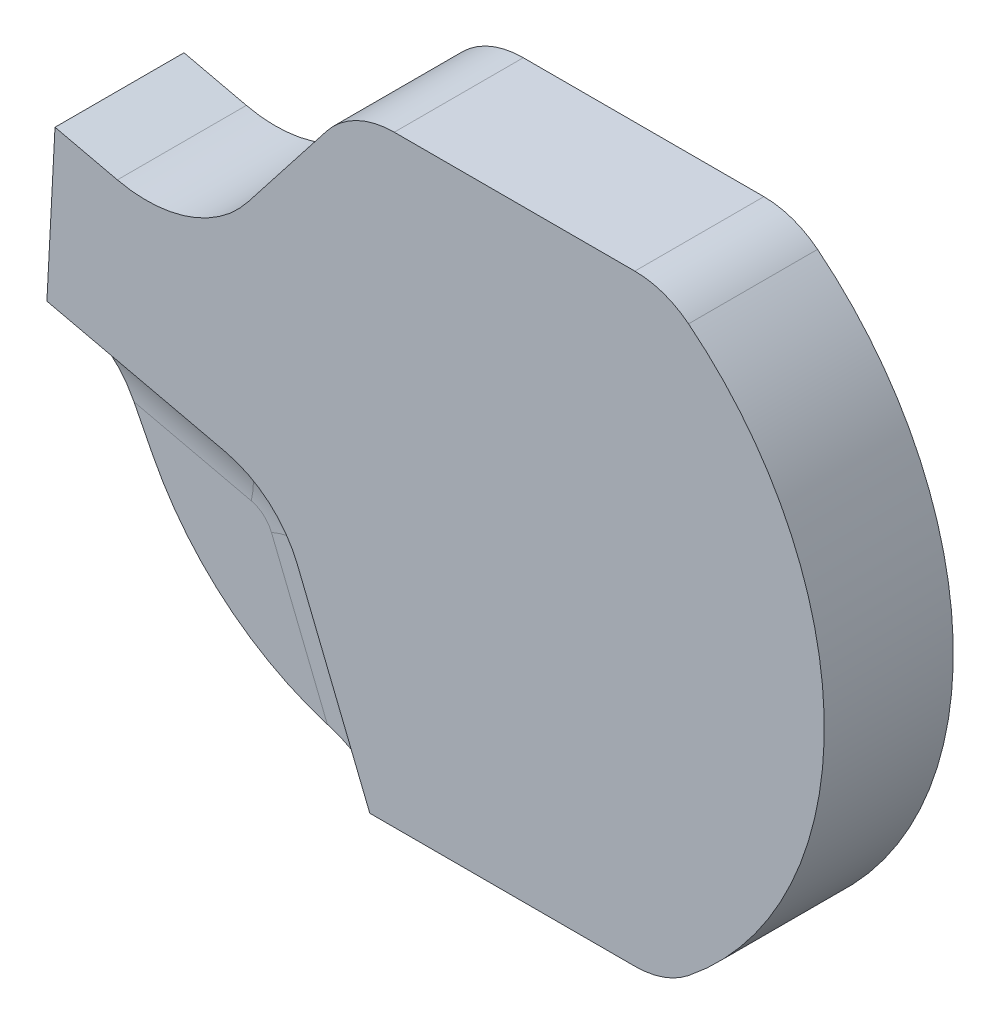
ISO-10303-21;
HEADER;
FILE_DESCRIPTION(('STEP AP214'),'2;1');
FILE_NAME('part.step','',(''),(''),'','','');
FILE_SCHEMA(('AUTOMOTIVE_DESIGN { 1 0 10303 214 1 1 1 1 }'));
ENDSEC;
DATA;
#1=APPLICATION_CONTEXT('core data for automotive mechanical design processes');
#2=APPLICATION_PROTOCOL_DEFINITION('international standard','automotive_design',2000,#1);
#3=PRODUCT_CONTEXT('',#1,'mechanical');
#4=PRODUCT('Part','Part','',(#3));
#5=PRODUCT_RELATED_PRODUCT_CATEGORY('part','',(#4));
#6=PRODUCT_DEFINITION_FORMATION('','',#4);
#7=PRODUCT_DEFINITION_CONTEXT('part definition',#1,'design');
#8=PRODUCT_DEFINITION('design','',#6,#7);
#9=PRODUCT_DEFINITION_SHAPE('','',#8);
#10=(LENGTH_UNIT() NAMED_UNIT(*) SI_UNIT(.MILLI.,.METRE.));
#11=(NAMED_UNIT(*) PLANE_ANGLE_UNIT() SI_UNIT($,.RADIAN.));
#12=(NAMED_UNIT(*) SI_UNIT($,.STERADIAN.) SOLID_ANGLE_UNIT());
#13=UNCERTAINTY_MEASURE_WITH_UNIT(LENGTH_MEASURE(1.E-05),#10,'distance_accuracy_value','');
#14=(GEOMETRIC_REPRESENTATION_CONTEXT(3) GLOBAL_UNCERTAINTY_ASSIGNED_CONTEXT((#13)) GLOBAL_UNIT_ASSIGNED_CONTEXT((#10,
#11,#12)) REPRESENTATION_CONTEXT('',''));
#15=CARTESIAN_POINT('',(0.,0.,0.));
#16=DIRECTION('',(0.,0.,1.));
#17=DIRECTION('',(1.,0.,0.));
#18=AXIS2_PLACEMENT_3D('',#15,#16,#17);
#19=CARTESIAN_POINT('',(-48.3882600591471,-2.20913909298127,15.));
#20=DIRECTION('',(0.891006524188372,0.453990499739538,0.));
#21=DIRECTION('',(-0.453990499739538,0.891006524188372,0.));
#22=AXIS2_PLACEMENT_3D('',#19,#20,#21);
#23=PLANE('',#22);
#24=DIRECTION('',(0.453990499739538,-0.891006524188372,0.));
#25=VECTOR('',#24,1.);
#26=CARTESIAN_POINT('',(-51.0702698081004,3.05460141618184,10.));
#27=LINE('',#26,#25);
#28=CARTESIAN_POINT('',(-43.2558253892938,-12.2821092948545,10.));
#29=VERTEX_POINT('',#28);
#30=CARTESIAN_POINT('',(-41.1394769418362,-16.4356769911443,10.));
#31=VERTEX_POINT('',#30);
#32=EDGE_CURVE('E320',#29,#31,#27,.T.);
#33=ORIENTED_EDGE('',*,*,#32,.F.);
#34=CARTESIAN_POINT('',(-43.2558253892938,-12.2821092948545,20.));
#35=DIRECTION('',(0.891006524188372,0.453990499739538,0.));
#36=DIRECTION('',(0.453990499739538,-0.891006524188372,0.));
#37=AXIS2_PLACEMENT_3D('',#34,#35,#36);
#38=ELLIPSE('',#37,13.0540728933227,10.);
#39=CARTESIAN_POINT('',(-48.3882600591471,-2.20913909298127,15.));
#40=VERTEX_POINT('',#39);
#41=EDGE_CURVE('E152',#29,#40,#38,.T.);
#42=ORIENTED_EDGE('',*,*,#41,.T.);
#43=DIRECTION('',(0.,0.,-1.));
#44=VECTOR('',#43,1.);
#45=CARTESIAN_POINT('',(-48.3882600591471,-2.20913909298127,15.));
#46=LINE('',#45,#44);
#47=CARTESIAN_POINT('',(-48.3882600591471,-2.20913909298127,0.));
#48=VERTEX_POINT('',#47);
#49=EDGE_CURVE('E62',#40,#48,#46,.T.);
#50=ORIENTED_EDGE('',*,*,#49,.T.);
#51=CARTESIAN_POINT('',(-43.2558253892938,-12.2821092948545,-5.));
#52=DIRECTION('',(0.891006524188372,0.453990499739538,0.));
#53=DIRECTION('',(0.453990499739538,-0.891006524188372,0.));
#54=AXIS2_PLACEMENT_3D('',#51,#52,#53);
#55=ELLIPSE('',#54,13.0540728933227,10.);
#56=CARTESIAN_POINT('',(-43.2558253892938,-12.2821092948545,5.));
#57=VERTEX_POINT('',#56);
#58=EDGE_CURVE('E45',#48,#57,#55,.T.);
#59=ORIENTED_EDGE('',*,*,#58,.T.);
#60=DIRECTION('',(-0.453990499739538,0.891006524188372,0.));
#61=VECTOR('',#60,1.);
#62=CARTESIAN_POINT('',(-48.3882600591471,-2.20913909298127,5.));
#63=LINE('',#62,#61);
#64=CARTESIAN_POINT('',(-41.1394769418362,-16.4356769911443,5.));
#65=VERTEX_POINT('',#64);
#66=EDGE_CURVE('E149',#65,#57,#63,.T.);
#67=ORIENTED_EDGE('',*,*,#66,.F.);
#68=DIRECTION('',(0.,0.,-1.));
#69=VECTOR('',#68,1.);
#70=CARTESIAN_POINT('',(-41.1394769418362,-16.4356769911443,15.));
#71=LINE('',#70,#69);
#72=EDGE_CURVE('E272',#31,#65,#71,.T.);
#73=ORIENTED_EDGE('',*,*,#72,.F.);
#74=EDGE_LOOP('',(#33,#42,#50,#59,#67,#73));
#75=FACE_BOUND('',#74,.T.);
#76=ADVANCED_FACE('F35',(#75),#23,.F.);
#77=CARTESIAN_POINT('',(-10.8452551194316,-0.999999999999999,15.));
#78=DIRECTION('',(0.,0.,-1.));
#79=DIRECTION('',(-1.,0.,0.));
#80=AXIS2_PLACEMENT_3D('',#77,#78,#79);
#81=CYLINDRICAL_SURFACE('',#80,34.);
#82=CARTESIAN_POINT('',(-10.8452551194316,-0.999999999999999,10.));
#83=DIRECTION('',(0.,0.,1.));
#84=DIRECTION('',(1.,0.,0.));
#85=AXIS2_PLACEMENT_3D('',#82,#83,#84);
#86=CIRCLE('',#85,34.);
#87=CARTESIAN_POINT('',(-20.7858745214471,-33.5143673766579,10.));
#88=VERTEX_POINT('',#87);
#89=EDGE_CURVE('E294',#31,#88,#86,.T.);
#90=ORIENTED_EDGE('',*,*,#89,.F.);
#91=ORIENTED_EDGE('',*,*,#72,.T.);
#92=CARTESIAN_POINT('',(-10.8452551194316,-0.999999999999999,5.));
#93=DIRECTION('',(0.,0.,-1.));
#94=DIRECTION('',(-1.,0.,0.));
#95=AXIS2_PLACEMENT_3D('',#92,#93,#94);
#96=CIRCLE('',#95,34.);
#97=CARTESIAN_POINT('',(-20.7858745214471,-33.5143673766578,5.));
#98=VERTEX_POINT('',#97);
#99=EDGE_CURVE('E376',#98,#65,#96,.T.);
#100=ORIENTED_EDGE('',*,*,#99,.F.);
#101=CARTESIAN_POINT('',(-20.7858745214471,-33.5143673766578,5.));
#102=CARTESIAN_POINT('',(-20.5824014908783,-33.5765773921944,4.99999636897066));
#103=CARTESIAN_POINT('',(-20.3783618980623,-33.6368667130892,4.9958977195484));
#104=CARTESIAN_POINT('',(-19.9694722426194,-33.7535321603187,4.97912104885075));
#105=CARTESIAN_POINT('',(-19.7646220115781,-33.8099074229066,4.96644114047289));
#106=CARTESIAN_POINT('',(-19.1486555100941,-33.973231663272,4.91487930008342));
#107=CARTESIAN_POINT('',(-18.7369391012313,-34.0741298952683,4.86247209172724));
#108=CARTESIAN_POINT('',(-17.9148027015898,-34.2595836593446,4.71842440237845));
#109=CARTESIAN_POINT('',(-17.5043954669564,-34.3440685969984,4.62661967066696));
#110=CARTESIAN_POINT('',(-16.6922909652377,-34.4960058923516,4.40126960981798));
#111=CARTESIAN_POINT('',(-16.2905842104175,-34.5634777562219,4.2677724796083));
#112=CARTESIAN_POINT('',(-15.6253349278063,-34.6634243203007,4.00594131674694));
#113=CARTESIAN_POINT('',(-15.357888520239,-34.7002438300998,3.88906061920885));
#114=CARTESIAN_POINT('',(-14.8320759103812,-34.7664833652139,3.63451834794716));
#115=CARTESIAN_POINT('',(-14.573709433976,-34.7959036140708,3.49685740222504));
#116=CARTESIAN_POINT('',(-14.0696293599529,-34.8477078822301,3.2015184461672));
#117=CARTESIAN_POINT('',(-13.8238604632259,-34.8701253419094,3.04394077792106));
#118=CARTESIAN_POINT('',(-13.3459599875046,-34.9087589776598,2.70862686852343));
#119=CARTESIAN_POINT('',(-13.113827191736,-34.9249757077471,2.5308924301581));
#120=CARTESIAN_POINT('',(-12.6909428155918,-34.9504506861143,2.1772941270268));
#121=CARTESIAN_POINT('',(-12.4984851583914,-34.9602899004989,2.00350858610352));
#122=CARTESIAN_POINT('',(-12.1276007103684,-34.9763158120366,1.64142881602736));
#123=CARTESIAN_POINT('',(-11.9491721884026,-34.9825029604562,1.45313638266626));
#124=CARTESIAN_POINT('',(-11.6064112243912,-34.9919150526872,1.06142497739436));
#125=CARTESIAN_POINT('',(-11.4422007129739,-34.9951163110218,0.857898662767727));
#126=CARTESIAN_POINT('',(-11.1306953253119,-34.9991584144982,0.438156174986671));
#127=CARTESIAN_POINT('',(-10.983406579984,-34.9999984067013,0.221935445128264));
#128=CARTESIAN_POINT('',(-10.8452551194316,-35.,0.));
#129=B_SPLINE_CURVE_WITH_KNOTS('',3,(#101,#102,#103,#104,#105,#106,#107,#108,#109,#110,#111,
#112,#113,#114,#115,#116,#117,#118,#119,#120,#121,#122,#123,#124,#125,#126,#127,#128),
.UNSPECIFIED.,.F.,.F.,(4,2,2,2,2,2,2,2,2,2,2,2,2,4),(0.,0.638214939910872,1.27657027513296,
2.55583017904862,3.84047601487553,5.12364218596572,6.00532786909668,6.88698691206913,
7.7643690334623,8.64167274513158,9.41937935639732,10.1969898504474,10.9807175247958,
11.7647282615994),.UNSPECIFIED.);
#130=CARTESIAN_POINT('',(-10.8452551194316,-35.,0.));
#131=VERTEX_POINT('',#130);
#132=EDGE_CURVE('E11',#98,#131,#129,.T.);
#133=ORIENTED_EDGE('',*,*,#132,.T.);
#134=DIRECTION('',(0.,0.,-1.));
#135=VECTOR('',#134,1.);
#136=CARTESIAN_POINT('',(-10.8452551194316,-35.,15.));
#137=LINE('',#136,#135);
#138=CARTESIAN_POINT('',(-10.8452551194316,-35.,15.));
#139=VERTEX_POINT('',#138);
#140=EDGE_CURVE('E53',#139,#131,#137,.T.);
#141=ORIENTED_EDGE('',*,*,#140,.F.);
#142=CARTESIAN_POINT('',(-10.8452551194316,-35.,15.));
#143=CARTESIAN_POINT('',(-10.9195231283957,-34.9999994893224,14.880729524576));
#144=CARTESIAN_POINT('',(-10.9964067097171,-34.9997566265536,14.7631103876154));
#145=CARTESIAN_POINT('',(-11.1552418628537,-34.998679763102,14.5313529205718));
#146=CARTESIAN_POINT('',(-11.2371932882871,-34.997845779486,14.4172144900925));
#147=CARTESIAN_POINT('',(-11.4903129903694,-34.9942988668677,14.0804080287862));
#148=CARTESIAN_POINT('',(-11.668833551996,-34.9905412229055,13.8632095396222));
#149=CARTESIAN_POINT('',(-12.0428760631038,-34.979413564975,13.4459164943761));
#150=CARTESIAN_POINT('',(-12.2383177252036,-34.9720599153071,13.2457492336729));
#151=CARTESIAN_POINT('',(-12.6451178395904,-34.9529371616458,12.8625123729255));
#152=CARTESIAN_POINT('',(-12.856477015057,-34.9411678569392,12.6794435505612));
#153=CARTESIAN_POINT('',(-13.2929533523944,-34.912483712812,12.3314446738349));
#154=CARTESIAN_POINT('',(-13.5180570808659,-34.8955738352419,12.1664973361138));
#155=CARTESIAN_POINT('',(-13.9802234098891,-34.8559560715417,11.8550798333857));
#156=CARTESIAN_POINT('',(-14.2172868535772,-34.833247776175,11.7086109736303));
#157=CARTESIAN_POINT('',(-14.7015027005375,-34.7814841848286,11.4343359389002));
#158=CARTESIAN_POINT('',(-14.9486617434447,-34.7524246553114,11.3065423075231));
#159=CARTESIAN_POINT('',(-15.4509377428568,-34.6875617361541,11.0697221300279));
#160=CARTESIAN_POINT('',(-15.706054822198,-34.6517582423745,10.9606958737632));
#161=CARTESIAN_POINT('',(-16.2384086343655,-34.5706837297125,10.7549520533553));
#162=CARTESIAN_POINT('',(-16.5160347038959,-34.5249626106216,10.659420544506));
#163=CARTESIAN_POINT('',(-17.0760448274719,-34.4254119094619,10.4886792674116));
#164=CARTESIAN_POINT('',(-17.3584293942435,-34.371581448589,10.4134717041302));
#165=CARTESIAN_POINT('',(-17.9260545755706,-34.2557693782644,10.2826209484564));
#166=CARTESIAN_POINT('',(-18.2112955131101,-34.1937868371781,10.2269799948458));
#167=CARTESIAN_POINT('',(-18.7828563468734,-34.0617680479135,10.1343833089674));
#168=CARTESIAN_POINT('',(-19.0691759766827,-33.9917336764914,10.0974232332724));
#169=CARTESIAN_POINT('',(-19.5947750728044,-33.8558527433217,10.0457721823688));
#170=CARTESIAN_POINT('',(-19.8341074740525,-33.791187284531,10.0284317083314));
#171=CARTESIAN_POINT('',(-20.3111887510113,-33.6566612193578,10.0055616634759));
#172=CARTESIAN_POINT('',(-20.5489401482296,-33.5868149390558,10.0000006937643));
#173=CARTESIAN_POINT('',(-20.7858745214471,-33.5143673766578,10.));
#174=B_SPLINE_CURVE_WITH_KNOTS('',3,(#142,#143,#144,#145,#146,#147,#148,#149,#150,#151,#152,
#153,#154,#155,#156,#157,#158,#159,#160,#161,#162,#163,#164,#165,#166,#167,#168,#169,#170,#171,
#172,#173),.UNSPECIFIED.,.F.,.F.,(4,2,2,2,2,2,2,2,2,2,2,2,2,2,2,4),(0.,0.42143797491096,
0.842863782508636,1.68522465594878,2.52378738723044,3.36238823989969,4.20018220370516,
5.03803531310138,5.87644862224617,6.71487487913582,7.60540747365494,8.49603664413292,
9.3867676859197,10.2772915314919,11.0225180797156,11.7657556743246),.UNSPECIFIED.);
#175=EDGE_CURVE('E150',#139,#88,#174,.T.);
#176=ORIENTED_EDGE('',*,*,#175,.T.);
#177=EDGE_LOOP('',(#90,#91,#100,#133,#141,#176));
#178=FACE_BOUND('',#177,.T.);
#179=ADVANCED_FACE('F163',(#178),#81,.T.);
#180=CARTESIAN_POINT('',(-8.00000000000001,25.,15.));
#181=DIRECTION('',(0.,0.,-1.));
#182=DIRECTION('',(-1.,0.,0.));
#183=AXIS2_PLACEMENT_3D('',#180,#181,#182);
#184=CYLINDRICAL_SURFACE('',#183,10.);
#185=CARTESIAN_POINT('',(-8.00000000000001,25.,0.));
#186=DIRECTION('',(0.,0.,1.));
#187=DIRECTION('',(1.,0.,0.));
#188=AXIS2_PLACEMENT_3D('',#185,#186,#187);
#189=CIRCLE('',#188,10.);
#190=CARTESIAN_POINT('',(-8.00000000000001,35.,0.));
#191=VERTEX_POINT('',#190);
#192=CARTESIAN_POINT('',(-15.8801075360673,31.1566147532565,0.));
#193=VERTEX_POINT('',#192);
#194=EDGE_CURVE('E232',#191,#193,#189,.T.);
#195=ORIENTED_EDGE('',*,*,#194,.T.);
#196=DIRECTION('',(0.,0.,-1.));
#197=VECTOR('',#196,1.);
#198=CARTESIAN_POINT('',(-15.8801075360673,31.1566147532565,15.));
#199=LINE('',#198,#197);
#200=CARTESIAN_POINT('',(-15.8801075360673,31.1566147532565,15.));
#201=VERTEX_POINT('',#200);
#202=EDGE_CURVE('E227',#201,#193,#199,.T.);
#203=ORIENTED_EDGE('',*,*,#202,.F.);
#204=CARTESIAN_POINT('',(-8.00000000000001,25.,15.));
#205=DIRECTION('',(0.,0.,1.));
#206=DIRECTION('',(1.,0.,0.));
#207=AXIS2_PLACEMENT_3D('',#204,#205,#206);
#208=CIRCLE('',#207,10.);
#209=CARTESIAN_POINT('',(-8.00000000000001,35.,15.));
#210=VERTEX_POINT('',#209);
#211=EDGE_CURVE('E258',#210,#201,#208,.T.);
#212=ORIENTED_EDGE('',*,*,#211,.F.);
#213=DIRECTION('',(0.,0.,-1.));
#214=VECTOR('',#213,1.);
#215=CARTESIAN_POINT('',(-8.00000000000001,35.,15.));
#216=LINE('',#215,#214);
#217=EDGE_CURVE('E259',#210,#191,#216,.T.);
#218=ORIENTED_EDGE('',*,*,#217,.T.);
#219=EDGE_LOOP('',(#195,#203,#212,#218));
#220=FACE_BOUND('',#219,.T.);
#221=ADVANCED_FACE('F174',(#220),#184,.T.);
#222=CARTESIAN_POINT('',(-15.8801075360673,31.1566147532565,15.));
#223=DIRECTION('',(0.788010753606725,-0.615661475325654,0.));
#224=DIRECTION('',(0.615661475325654,0.788010753606726,0.));
#225=AXIS2_PLACEMENT_3D('',#222,#223,#224);
#226=PLANE('',#225);
#227=DIRECTION('',(-0.615661475325654,-0.788010753606725,0.));
#228=VECTOR('',#227,1.);
#229=CARTESIAN_POINT('',(-15.8801075360673,31.1566147532565,0.));
#230=LINE('',#229,#228);
#231=CARTESIAN_POINT('',(-25.0001652410236,19.4834732086796,0.));
#232=VERTEX_POINT('',#231);
#233=EDGE_CURVE('E218',#193,#232,#230,.T.);
#234=ORIENTED_EDGE('',*,*,#233,.T.);
#235=DIRECTION('',(0.,0.,-1.));
#236=VECTOR('',#235,1.);
#237=CARTESIAN_POINT('',(-25.0001652410236,19.4834732086796,15.));
#238=LINE('',#237,#236);
#239=CARTESIAN_POINT('',(-25.0001652410236,19.4834732086796,15.));
#240=VERTEX_POINT('',#239);
#241=EDGE_CURVE('E223',#240,#232,#238,.T.);
#242=ORIENTED_EDGE('',*,*,#241,.F.);
#243=DIRECTION('',(-0.615661475325654,-0.788010753606725,0.));
#244=VECTOR('',#243,1.);
#245=CARTESIAN_POINT('',(-15.8801075360673,31.1566147532565,15.));
#246=LINE('',#245,#244);
#247=EDGE_CURVE('E366',#201,#240,#246,.T.);
#248=ORIENTED_EDGE('',*,*,#247,.F.);
#249=ORIENTED_EDGE('',*,*,#202,.T.);
#250=EDGE_LOOP('',(#234,#242,#248,#249));
#251=FACE_BOUND('',#250,.T.);
#252=ADVANCED_FACE('F206',(#251),#226,.F.);
#253=CARTESIAN_POINT('',(-36.8203265451244,28.7183953385644,15.));
#254=DIRECTION('',(0.,0.,-1.));
#255=DIRECTION('',(-1.,0.,0.));
#256=AXIS2_PLACEMENT_3D('',#253,#254,#255);
#257=CYLINDRICAL_SURFACE('',#256,15.);
#258=CARTESIAN_POINT('',(-36.8203265451244,28.7183953385644,0.));
#259=DIRECTION('',(0.,0.,1.));
#260=DIRECTION('',(1.,0.,0.));
#261=AXIS2_PLACEMENT_3D('',#258,#259,#260);
#262=CIRCLE('',#261,15.);
#263=CARTESIAN_POINT('',(-40.1945923602825,14.1028443667859,0.));
#264=VERTEX_POINT('',#263);
#265=EDGE_CURVE('E231',#264,#232,#262,.T.);
#266=ORIENTED_EDGE('',*,*,#265,.F.);
#267=DIRECTION('',(0.,0.,-1.));
#268=VECTOR('',#267,1.);
#269=CARTESIAN_POINT('',(-40.1945923602825,14.1028443667859,15.));
#270=LINE('',#269,#268);
#271=CARTESIAN_POINT('',(-40.1945923602825,14.1028443667859,15.));
#272=VERTEX_POINT('',#271);
#273=EDGE_CURVE('E278',#272,#264,#270,.T.);
#274=ORIENTED_EDGE('',*,*,#273,.F.);
#275=CARTESIAN_POINT('',(-36.8203265451244,28.7183953385644,15.));
#276=DIRECTION('',(0.,0.,1.));
#277=DIRECTION('',(1.,0.,0.));
#278=AXIS2_PLACEMENT_3D('',#275,#276,#277);
#279=CIRCLE('',#278,15.);
#280=EDGE_CURVE('E389',#272,#240,#279,.T.);
#281=ORIENTED_EDGE('',*,*,#280,.T.);
#282=ORIENTED_EDGE('',*,*,#241,.T.);
#283=EDGE_LOOP('',(#266,#274,#281,#282));
#284=FACE_BOUND('',#283,.T.);
#285=ADVANCED_FACE('F204',(#284),#257,.F.);
#286=CARTESIAN_POINT('',(-40.1945923602825,14.1028443667859,15.));
#287=DIRECTION('',(-0.224951054343868,-0.974370064785234,0.));
#288=DIRECTION('',(0.974370064785235,-0.224951054343868,0.));
#289=AXIS2_PLACEMENT_3D('',#286,#287,#288);
#290=PLANE('',#289);
#291=DIRECTION('',(-0.974370064785234,0.224951054343868,0.));
#292=VECTOR('',#291,1.);
#293=CARTESIAN_POINT('',(-40.1945923602825,14.1028443667859,0.));
#294=LINE('',#293,#292);
#295=CARTESIAN_POINT('',(-47.4456525559756,15.7768835179081,0.));
#296=VERTEX_POINT('',#295);
#297=EDGE_CURVE('E85',#264,#296,#294,.T.);
#298=ORIENTED_EDGE('',*,*,#297,.T.);
#299=DIRECTION('',(0.,0.,-1.));
#300=VECTOR('',#299,1.);
#301=CARTESIAN_POINT('',(-47.4456525559756,15.7768835179081,15.));
#302=LINE('',#301,#300);
#303=CARTESIAN_POINT('',(-47.4456525559756,15.7768835179081,15.));
#304=VERTEX_POINT('',#303);
#305=EDGE_CURVE('E276',#304,#296,#302,.T.);
#306=ORIENTED_EDGE('',*,*,#305,.F.);
#307=DIRECTION('',(-0.974370064785234,0.224951054343868,0.));
#308=VECTOR('',#307,1.);
#309=CARTESIAN_POINT('',(-40.1945923602825,14.1028443667859,15.));
#310=LINE('',#309,#308);
#311=EDGE_CURVE('E391',#272,#304,#310,.T.);
#312=ORIENTED_EDGE('',*,*,#311,.F.);
#313=ORIENTED_EDGE('',*,*,#273,.T.);
#314=EDGE_LOOP('',(#298,#306,#312,#313));
#315=FACE_BOUND('',#314,.T.);
#316=ADVANCED_FACE('F201',(#315),#290,.F.);
#317=CARTESIAN_POINT('',(-47.4456525559756,15.7768835179081,15.));
#318=DIRECTION('',(0.998629534754573,-0.0523359562429546,0.));
#319=DIRECTION('',(0.0523359562429546,0.998629534754573,0.));
#320=AXIS2_PLACEMENT_3D('',#317,#318,#319);
#321=PLANE('',#320);
#322=DIRECTION('',(-0.0523359562429546,-0.998629534754573,0.));
#323=VECTOR('',#322,1.);
#324=CARTESIAN_POINT('',(-47.4456525559756,15.7768835179081,0.));
#325=LINE('',#324,#323);
#326=EDGE_CURVE('E239',#296,#48,#325,.T.);
#327=ORIENTED_EDGE('',*,*,#326,.T.);
#328=ORIENTED_EDGE('',*,*,#49,.F.);
#329=DIRECTION('',(-0.0523359562429546,-0.998629534754573,0.));
#330=VECTOR('',#329,1.);
#331=CARTESIAN_POINT('',(-47.4456525559756,15.7768835179081,15.));
#332=LINE('',#331,#330);
#333=EDGE_CURVE('E325',#304,#40,#332,.T.);
#334=ORIENTED_EDGE('',*,*,#333,.F.);
#335=ORIENTED_EDGE('',*,*,#305,.T.);
#336=EDGE_LOOP('',(#327,#328,#334,#335));
#337=FACE_BOUND('',#336,.T.);
#338=ADVANCED_FACE('F197',(#337),#321,.F.);
#339=CARTESIAN_POINT('',(-8.,-35.,15.));
#340=DIRECTION('',(0.,1.,0.));
#341=DIRECTION('',(0.,0.,1.));
#342=AXIS2_PLACEMENT_3D('',#339,#340,#341);
#343=PLANE('',#342);
#344=DIRECTION('',(1.,0.,0.));
#345=VECTOR('',#344,1.);
#346=CARTESIAN_POINT('',(-8.,-35.,0.));
#347=LINE('',#346,#345);
#348=CARTESIAN_POINT('',(19.9749843554382,-35.,0.));
#349=VERTEX_POINT('',#348);
#350=EDGE_CURVE('E244',#131,#349,#347,.T.);
#351=ORIENTED_EDGE('',*,*,#350,.T.);
#352=DIRECTION('',(0.,0.,-1.));
#353=VECTOR('',#352,1.);
#354=CARTESIAN_POINT('',(19.9749843554382,-35.,15.));
#355=LINE('',#354,#353);
#356=CARTESIAN_POINT('',(19.9749843554382,-35.,15.));
#357=VERTEX_POINT('',#356);
#358=EDGE_CURVE('E268',#357,#349,#355,.T.);
#359=ORIENTED_EDGE('',*,*,#358,.F.);
#360=DIRECTION('',(-1.,0.,0.));
#361=VECTOR('',#360,1.);
#362=CARTESIAN_POINT('',(-8.,-35.,15.));
#363=LINE('',#362,#361);
#364=EDGE_CURVE('E394',#357,#139,#363,.T.);
#365=ORIENTED_EDGE('',*,*,#364,.T.);
#366=ORIENTED_EDGE('',*,*,#140,.T.);
#367=EDGE_LOOP('',(#351,#359,#365,#366));
#368=FACE_BOUND('',#367,.T.);
#369=ADVANCED_FACE('F200',(#368),#343,.F.);
#370=CARTESIAN_POINT('',(19.9749843554382,-25.,15.));
#371=DIRECTION('',(0.,0.,-1.));
#372=DIRECTION('',(-1.,0.,0.));
#373=AXIS2_PLACEMENT_3D('',#370,#371,#372);
#374=CYLINDRICAL_SURFACE('',#373,10.);
#375=CARTESIAN_POINT('',(19.9749843554382,-25.,0.));
#376=DIRECTION('',(0.,0.,1.));
#377=DIRECTION('',(1.,0.,0.));
#378=AXIS2_PLACEMENT_3D('',#375,#376,#377);
#379=CIRCLE('',#378,10.);
#380=CARTESIAN_POINT('',(26.2171669665126,-32.8125,0.));
#381=VERTEX_POINT('',#380);
#382=EDGE_CURVE('E246',#349,#381,#379,.T.);
#383=ORIENTED_EDGE('',*,*,#382,.T.);
#384=DIRECTION('',(0.,0.,-1.));
#385=VECTOR('',#384,1.);
#386=CARTESIAN_POINT('',(26.2171669665126,-32.8125,15.));
#387=LINE('',#386,#385);
#388=CARTESIAN_POINT('',(26.2171669665126,-32.8125,15.));
#389=VERTEX_POINT('',#388);
#390=EDGE_CURVE('E266',#389,#381,#387,.T.);
#391=ORIENTED_EDGE('',*,*,#390,.F.);
#392=CARTESIAN_POINT('',(19.9749843554382,-25.,15.));
#393=DIRECTION('',(0.,0.,1.));
#394=DIRECTION('',(1.,0.,0.));
#395=AXIS2_PLACEMENT_3D('',#392,#393,#394);
#396=CIRCLE('',#395,10.);
#397=EDGE_CURVE('E396',#357,#389,#396,.T.);
#398=ORIENTED_EDGE('',*,*,#397,.F.);
#399=ORIENTED_EDGE('',*,*,#358,.T.);
#400=EDGE_LOOP('',(#383,#391,#398,#399));
#401=FACE_BOUND('',#400,.T.);
#402=ADVANCED_FACE('F408',(#401),#374,.T.);
#403=CARTESIAN_POINT('',(0.,0.,15.));
#404=DIRECTION('',(0.,0.,-1.));
#405=DIRECTION('',(-1.,0.,0.));
#406=AXIS2_PLACEMENT_3D('',#403,#404,#405);
#407=CYLINDRICAL_SURFACE('',#406,42.);
#408=CARTESIAN_POINT('',(0.,0.,0.));
#409=DIRECTION('',(0.,0.,-1.));
#410=DIRECTION('',(-1.,0.,0.));
#411=AXIS2_PLACEMENT_3D('',#408,#409,#410);
#412=CIRCLE('',#411,42.);
#413=CARTESIAN_POINT('',(26.2171669665126,32.8125,0.));
#414=VERTEX_POINT('',#413);
#415=EDGE_CURVE('E249',#414,#381,#412,.T.);
#416=ORIENTED_EDGE('',*,*,#415,.F.);
#417=DIRECTION('',(0.,0.,-1.));
#418=VECTOR('',#417,1.);
#419=CARTESIAN_POINT('',(26.2171669665126,32.8125,15.));
#420=LINE('',#419,#418);
#421=CARTESIAN_POINT('',(26.2171669665126,32.8125,15.));
#422=VERTEX_POINT('',#421);
#423=EDGE_CURVE('E264',#422,#414,#420,.T.);
#424=ORIENTED_EDGE('',*,*,#423,.F.);
#425=CARTESIAN_POINT('',(0.,0.,15.));
#426=DIRECTION('',(0.,0.,-1.));
#427=DIRECTION('',(-1.,0.,0.));
#428=AXIS2_PLACEMENT_3D('',#425,#426,#427);
#429=CIRCLE('',#428,42.);
#430=EDGE_CURVE('E373',#422,#389,#429,.T.);
#431=ORIENTED_EDGE('',*,*,#430,.T.);
#432=ORIENTED_EDGE('',*,*,#390,.T.);
#433=EDGE_LOOP('',(#416,#424,#431,#432));
#434=FACE_BOUND('',#433,.T.);
#435=ADVANCED_FACE('F400',(#434),#407,.T.);
#436=CARTESIAN_POINT('',(19.9749843554382,25.,15.));
#437=DIRECTION('',(0.,0.,-1.));
#438=DIRECTION('',(-1.,0.,0.));
#439=AXIS2_PLACEMENT_3D('',#436,#437,#438);
#440=CYLINDRICAL_SURFACE('',#439,10.);
#441=CARTESIAN_POINT('',(19.9749843554382,25.,0.));
#442=DIRECTION('',(0.,0.,-1.));
#443=DIRECTION('',(-1.,0.,0.));
#444=AXIS2_PLACEMENT_3D('',#441,#442,#443);
#445=CIRCLE('',#444,10.);
#446=CARTESIAN_POINT('',(19.9749843554382,35.,0.));
#447=VERTEX_POINT('',#446);
#448=EDGE_CURVE('E252',#447,#414,#445,.T.);
#449=ORIENTED_EDGE('',*,*,#448,.F.);
#450=DIRECTION('',(0.,0.,-1.));
#451=VECTOR('',#450,1.);
#452=CARTESIAN_POINT('',(19.9749843554382,35.,15.));
#453=LINE('',#452,#451);
#454=CARTESIAN_POINT('',(19.9749843554382,35.,15.));
#455=VERTEX_POINT('',#454);
#456=EDGE_CURVE('E261',#455,#447,#453,.T.);
#457=ORIENTED_EDGE('',*,*,#456,.F.);
#458=CARTESIAN_POINT('',(19.9749843554382,25.,15.));
#459=DIRECTION('',(0.,0.,-1.));
#460=DIRECTION('',(-1.,0.,0.));
#461=AXIS2_PLACEMENT_3D('',#458,#459,#460);
#462=CIRCLE('',#461,10.);
#463=EDGE_CURVE('E371',#455,#422,#462,.T.);
#464=ORIENTED_EDGE('',*,*,#463,.T.);
#465=ORIENTED_EDGE('',*,*,#423,.T.);
#466=EDGE_LOOP('',(#449,#457,#464,#465));
#467=FACE_BOUND('',#466,.T.);
#468=ADVANCED_FACE('F405',(#467),#440,.T.);
#469=CARTESIAN_POINT('',(-8.00000000000001,35.,15.));
#470=DIRECTION('',(0.,1.,0.));
#471=DIRECTION('',(0.,0.,1.));
#472=AXIS2_PLACEMENT_3D('',#469,#470,#471);
#473=PLANE('',#472);
#474=DIRECTION('',(1.,0.,0.));
#475=VECTOR('',#474,1.);
#476=CARTESIAN_POINT('',(-8.00000000000001,35.,0.));
#477=LINE('',#476,#475);
#478=EDGE_CURVE('E255',#191,#447,#477,.T.);
#479=ORIENTED_EDGE('',*,*,#478,.F.);
#480=ORIENTED_EDGE('',*,*,#217,.F.);
#481=DIRECTION('',(1.,0.,0.));
#482=VECTOR('',#481,1.);
#483=CARTESIAN_POINT('',(-8.00000000000001,35.,15.));
#484=LINE('',#483,#482);
#485=EDGE_CURVE('E262',#210,#455,#484,.T.);
#486=ORIENTED_EDGE('',*,*,#485,.T.);
#487=ORIENTED_EDGE('',*,*,#456,.T.);
#488=EDGE_LOOP('',(#479,#480,#486,#487));
#489=FACE_BOUND('',#488,.T.);
#490=ADVANCED_FACE('F363',(#489),#473,.T.);
#491=CARTESIAN_POINT('',(-8.00000000000001,25.,15.));
#492=DIRECTION('',(0.,0.,1.));
#493=DIRECTION('',(1.,0.,0.));
#494=AXIS2_PLACEMENT_3D('',#491,#492,#493);
#495=PLANE('',#494);
#496=DIRECTION('',(-0.974370064785235,0.224951054343868,0.));
#497=VECTOR('',#496,1.);
#498=CARTESIAN_POINT('',(-16.0076169424686,-9.68479959681136,15.));
#499=LINE('',#498,#497);
#500=CARTESIAN_POINT('',(-27.6810743326112,-6.98976960496777,15.));
#501=VERTEX_POINT('',#500);
#502=EDGE_CURVE('E311',#501,#40,#499,.T.);
#503=ORIENTED_EDGE('',*,*,#502,.F.);
#504=CARTESIAN_POINT('',(-30.3804869847376,-18.6822103823906,15.));
#505=DIRECTION('',(0.,0.,1.));
#506=DIRECTION('',(1.,0.,0.));
#507=AXIS2_PLACEMENT_3D('',#504,#505,#506);
#508=CIRCLE('',#507,12.);
#509=CARTESIAN_POINT('',(-19.2542807299362,-14.1869312613995,15.));
#510=VERTEX_POINT('',#509);
#511=EDGE_CURVE('E309',#510,#501,#508,.T.);
#512=ORIENTED_EDGE('',*,*,#511,.F.);
#513=DIRECTION('',(-0.37460659341592,0.927183854566784,0.));
#514=VECTOR('',#513,1.);
#515=CARTESIAN_POINT('',(-31.2857312982483,15.591953867757,15.));
#516=LINE('',#515,#514);
#517=EDGE_CURVE('E301',#139,#510,#516,.T.);
#518=ORIENTED_EDGE('',*,*,#517,.F.);
#519=ORIENTED_EDGE('',*,*,#364,.F.);
#520=ORIENTED_EDGE('',*,*,#397,.T.);
#521=ORIENTED_EDGE('',*,*,#430,.F.);
#522=ORIENTED_EDGE('',*,*,#463,.F.);
#523=ORIENTED_EDGE('',*,*,#485,.F.);
#524=ORIENTED_EDGE('',*,*,#211,.T.);
#525=ORIENTED_EDGE('',*,*,#247,.T.);
#526=ORIENTED_EDGE('',*,*,#280,.F.);
#527=ORIENTED_EDGE('',*,*,#311,.T.);
#528=ORIENTED_EDGE('',*,*,#333,.T.);
#529=EDGE_LOOP('',(#503,#512,#518,#519,#520,#521,#522,#523,#524,#525,#526,#527,#528));
#530=FACE_BOUND('',#529,.T.);
#531=ADVANCED_FACE('F323',(#530),#495,.T.);
#532=CARTESIAN_POINT('',(-8.00000000000001,25.,0.));
#533=DIRECTION('',(0.,0.,1.));
#534=DIRECTION('',(1.,0.,0.));
#535=AXIS2_PLACEMENT_3D('',#532,#533,#534);
#536=PLANE('',#535);
#537=ORIENTED_EDGE('',*,*,#350,.F.);
#538=DIRECTION('',(0.37460659341592,-0.927183854566784,0.));
#539=VECTOR('',#538,1.);
#540=CARTESIAN_POINT('',(-19.2542807299362,-14.1869312613996,0.));
#541=LINE('',#540,#539);
#542=CARTESIAN_POINT('',(-19.2542807299362,-14.1869312613996,0.));
#543=VERTEX_POINT('',#542);
#544=EDGE_CURVE('E379',#543,#131,#541,.T.);
#545=ORIENTED_EDGE('',*,*,#544,.F.);
#546=CARTESIAN_POINT('',(-30.3804869847376,-18.6822103823906,0.));
#547=DIRECTION('',(0.,0.,-1.));
#548=DIRECTION('',(-1.,0.,0.));
#549=AXIS2_PLACEMENT_3D('',#546,#547,#548);
#550=CIRCLE('',#549,12.);
#551=CARTESIAN_POINT('',(-27.6810743326112,-6.98976960496777,0.));
#552=VERTEX_POINT('',#551);
#553=EDGE_CURVE('E384',#552,#543,#550,.T.);
#554=ORIENTED_EDGE('',*,*,#553,.F.);
#555=DIRECTION('',(0.974370064785235,-0.224951054343868,0.));
#556=VECTOR('',#555,1.);
#557=CARTESIAN_POINT('',(-48.3882600591471,-2.20913909298127,0.));
#558=LINE('',#557,#556);
#559=EDGE_CURVE('E133',#48,#552,#558,.T.);
#560=ORIENTED_EDGE('',*,*,#559,.F.);
#561=ORIENTED_EDGE('',*,*,#326,.F.);
#562=ORIENTED_EDGE('',*,*,#297,.F.);
#563=ORIENTED_EDGE('',*,*,#265,.T.);
#564=ORIENTED_EDGE('',*,*,#233,.F.);
#565=ORIENTED_EDGE('',*,*,#194,.F.);
#566=ORIENTED_EDGE('',*,*,#478,.T.);
#567=ORIENTED_EDGE('',*,*,#448,.T.);
#568=ORIENTED_EDGE('',*,*,#415,.T.);
#569=ORIENTED_EDGE('',*,*,#382,.F.);
#570=EDGE_LOOP('',(#537,#545,#554,#560,#561,#562,#563,#564,#565,#566,#567,#568,#569));
#571=FACE_BOUND('',#570,.T.);
#572=ADVANCED_FACE('F235',(#571),#536,.F.);
#573=CARTESIAN_POINT('',(-10.8452551194316,-0.999999999999999,5.));
#574=DIRECTION('',(0.,0.,-1.));
#575=DIRECTION('',(-1.,0.,0.));
#576=AXIS2_PLACEMENT_3D('',#573,#574,#575);
#577=PLANE('',#576);
#578=ORIENTED_EDGE('',*,*,#66,.T.);
#579=DIRECTION('',(-0.974370064785235,0.224951054343868,0.));
#580=VECTOR('',#579,1.);
#581=CARTESIAN_POINT('',(-29.62920760931,-15.4280618928788,5.));
#582=LINE('',#581,#580);
#583=CARTESIAN_POINT('',(-29.62920760931,-15.4280618928788,5.));
#584=VERTEX_POINT('',#583);
#585=EDGE_CURVE('E131',#57,#584,#582,.F.);
#586=ORIENTED_EDGE('',*,*,#585,.T.);
#587=CARTESIAN_POINT('',(-30.3804869847376,-18.6822103823906,5.));
#588=DIRECTION('',(0.,0.,-1.));
#589=DIRECTION('',(-1.,0.,0.));
#590=AXIS2_PLACEMENT_3D('',#587,#588,#589);
#591=CIRCLE('',#590,3.33974596215562);
#592=CARTESIAN_POINT('',(-27.2839284502723,-17.4311195246329,5.));
#593=VERTEX_POINT('',#592);
#594=EDGE_CURVE('E137',#584,#593,#591,.T.);
#595=ORIENTED_EDGE('',*,*,#594,.T.);
#596=DIRECTION('',(-0.37460659341592,0.927183854566784,0.));
#597=VECTOR('',#596,1.);
#598=CARTESIAN_POINT('',(-18.8749028397677,-38.2441882632333,5.));
#599=LINE('',#598,#597);
#600=EDGE_CURVE('E142',#593,#98,#599,.F.);
#601=ORIENTED_EDGE('',*,*,#600,.T.);
#602=ORIENTED_EDGE('',*,*,#99,.T.);
#603=EDGE_LOOP('',(#578,#586,#595,#601,#602));
#604=FACE_BOUND('',#603,.T.);
#605=ADVANCED_FACE('F146',(#604),#577,.T.);
#606=CARTESIAN_POINT('',(-10.8452551194316,-0.999999999999999,10.));
#607=DIRECTION('',(0.,0.,1.));
#608=DIRECTION('',(1.,0.,0.));
#609=AXIS2_PLACEMENT_3D('',#606,#607,#608);
#610=PLANE('',#609);
#611=ORIENTED_EDGE('',*,*,#89,.T.);
#612=DIRECTION('',(-0.37460659341592,0.927183854566784,0.));
#613=VECTOR('',#612,1.);
#614=CARTESIAN_POINT('',(-27.2839284502723,-17.4311195246329,10.));
#615=LINE('',#614,#613);
#616=CARTESIAN_POINT('',(-27.2839284502723,-17.4311195246329,10.));
#617=VERTEX_POINT('',#616);
#618=EDGE_CURVE('E143',#88,#617,#615,.T.);
#619=ORIENTED_EDGE('',*,*,#618,.T.);
#620=CARTESIAN_POINT('',(-30.3804869847376,-18.6822103823906,10.));
#621=DIRECTION('',(0.,0.,1.));
#622=DIRECTION('',(1.,0.,0.));
#623=AXIS2_PLACEMENT_3D('',#620,#621,#622);
#624=CIRCLE('',#623,3.33974596215561);
#625=CARTESIAN_POINT('',(-29.62920760931,-15.4280618928788,10.));
#626=VERTEX_POINT('',#625);
#627=EDGE_CURVE('E282',#617,#626,#624,.T.);
#628=ORIENTED_EDGE('',*,*,#627,.T.);
#629=DIRECTION('',(-0.974370064785235,0.224951054343868,0.));
#630=VECTOR('',#629,1.);
#631=CARTESIAN_POINT('',(-50.336393335846,-10.6474313808923,10.));
#632=LINE('',#631,#630);
#633=EDGE_CURVE('E284',#626,#29,#632,.T.);
#634=ORIENTED_EDGE('',*,*,#633,.T.);
#635=ORIENTED_EDGE('',*,*,#32,.T.);
#636=EDGE_LOOP('',(#611,#619,#628,#634,#635));
#637=FACE_BOUND('',#636,.T.);
#638=ADVANCED_FACE('F182',(#637),#610,.T.);
#639=CARTESIAN_POINT('',(-17.9557502191675,-18.1230918847224,20.));
#640=DIRECTION('',(0.974370064785235,-0.224951054343868,0.));
#641=DIRECTION('',(0.224951054343868,0.974370064785235,0.));
#642=AXIS2_PLACEMENT_3D('',#639,#640,#641);
#643=CYLINDRICAL_SURFACE('',#642,10.);
#644=ORIENTED_EDGE('',*,*,#41,.F.);
#645=ORIENTED_EDGE('',*,*,#633,.F.);
#646=CARTESIAN_POINT('',(-29.62920760931,-15.4280618928788,20.));
#647=DIRECTION('',(-0.974370064785234,0.224951054343868,0.));
#648=DIRECTION('',(-0.224951054343868,-0.974370064785234,0.));
#649=AXIS2_PLACEMENT_3D('',#646,#647,#648);
#650=CIRCLE('',#649,10.);
#651=EDGE_CURVE('E303',#501,#626,#650,.T.);
#652=ORIENTED_EDGE('',*,*,#651,.F.);
#653=ORIENTED_EDGE('',*,*,#502,.T.);
#654=EDGE_LOOP('',(#644,#645,#652,#653));
#655=FACE_BOUND('',#654,.T.);
#656=ADVANCED_FACE('F178',(#655),#643,.F.);
#657=CARTESIAN_POINT('',(-30.3804869847376,-18.6822103823906,20.));
#658=DIRECTION('',(0.,0.,-1.));
#659=DIRECTION('',(-1.,0.,0.));
#660=AXIS2_PLACEMENT_3D('',#657,#658,#659);
#661=DEGENERATE_TOROIDAL_SURFACE('',#660,3.33974596215561,10.,.T.);
#662=ORIENTED_EDGE('',*,*,#651,.T.);
#663=ORIENTED_EDGE('',*,*,#627,.F.);
#664=CARTESIAN_POINT('',(-27.2839284502723,-17.4311195246329,20.));
#665=DIRECTION('',(-0.37460659341592,0.927183854566784,0.));
#666=DIRECTION('',(-0.927183854566784,-0.37460659341592,0.));
#667=AXIS2_PLACEMENT_3D('',#664,#665,#666);
#668=CIRCLE('',#667,10.);
#669=EDGE_CURVE('E298',#510,#617,#668,.T.);
#670=ORIENTED_EDGE('',*,*,#669,.F.);
#671=ORIENTED_EDGE('',*,*,#511,.T.);
#672=EDGE_LOOP('',(#662,#663,#670,#671));
#673=FACE_BOUND('',#672,.T.);
#674=ADVANCED_FACE('F172',(#673),#661,.F.);
#675=CARTESIAN_POINT('',(-39.3153790185844,12.3477656045236,20.));
#676=DIRECTION('',(0.37460659341592,-0.927183854566784,0.));
#677=DIRECTION('',(0.927183854566784,0.37460659341592,0.));
#678=AXIS2_PLACEMENT_3D('',#675,#676,#677);
#679=CYLINDRICAL_SURFACE('',#678,10.);
#680=ORIENTED_EDGE('',*,*,#175,.F.);
#681=ORIENTED_EDGE('',*,*,#517,.T.);
#682=ORIENTED_EDGE('',*,*,#669,.T.);
#683=ORIENTED_EDGE('',*,*,#618,.F.);
#684=EDGE_LOOP('',(#680,#681,#682,#683));
#685=FACE_BOUND('',#684,.T.);
#686=ADVANCED_FACE('F167',(#685),#679,.F.);
#687=CARTESIAN_POINT('',(-27.2839284502723,-17.4311195246329,-5.));
#688=DIRECTION('',(0.37460659341592,-0.927183854566784,0.));
#689=DIRECTION('',(0.927183854566784,0.37460659341592,0.));
#690=AXIS2_PLACEMENT_3D('',#687,#688,#689);
#691=CYLINDRICAL_SURFACE('',#690,10.);
#692=ORIENTED_EDGE('',*,*,#132,.F.);
#693=ORIENTED_EDGE('',*,*,#600,.F.);
#694=CARTESIAN_POINT('',(-27.2839284502723,-17.4311195246329,-5.));
#695=DIRECTION('',(0.374606593415919,-0.927183854566784,0.));
#696=DIRECTION('',(0.927183854566784,0.374606593415919,0.));
#697=AXIS2_PLACEMENT_3D('',#694,#695,#696);
#698=CIRCLE('',#697,10.);
#699=EDGE_CURVE('E40',#543,#593,#698,.T.);
#700=ORIENTED_EDGE('',*,*,#699,.F.);
#701=ORIENTED_EDGE('',*,*,#544,.T.);
#702=EDGE_LOOP('',(#692,#693,#700,#701));
#703=FACE_BOUND('',#702,.T.);
#704=ADVANCED_FACE('F37',(#703),#691,.F.);
#705=CARTESIAN_POINT('',(-30.3804869847376,-18.6822103823906,-5.));
#706=DIRECTION('',(0.,0.,1.));
#707=DIRECTION('',(1.,0.,0.));
#708=AXIS2_PLACEMENT_3D('',#705,#706,#707);
#709=DEGENERATE_TOROIDAL_SURFACE('',#708,3.33974596215562,10.,.T.);
#710=ORIENTED_EDGE('',*,*,#699,.T.);
#711=ORIENTED_EDGE('',*,*,#594,.F.);
#712=CARTESIAN_POINT('',(-29.62920760931,-15.4280618928788,-5.));
#713=DIRECTION('',(0.974370064785234,-0.224951054343868,0.));
#714=DIRECTION('',(0.224951054343868,0.974370064785234,0.));
#715=AXIS2_PLACEMENT_3D('',#712,#713,#714);
#716=CIRCLE('',#715,10.);
#717=EDGE_CURVE('E126',#552,#584,#716,.T.);
#718=ORIENTED_EDGE('',*,*,#717,.F.);
#719=ORIENTED_EDGE('',*,*,#553,.T.);
#720=EDGE_LOOP('',(#710,#711,#718,#719));
#721=FACE_BOUND('',#720,.T.);
#722=ADVANCED_FACE('F138',(#721),#709,.F.);
#723=CARTESIAN_POINT('',(-50.3363933358459,-10.6474313808923,-5.));
#724=DIRECTION('',(0.974370064785235,-0.224951054343868,0.));
#725=DIRECTION('',(0.224951054343868,0.974370064785235,0.));
#726=AXIS2_PLACEMENT_3D('',#723,#724,#725);
#727=CYLINDRICAL_SURFACE('',#726,10.);
#728=ORIENTED_EDGE('',*,*,#58,.F.);
#729=ORIENTED_EDGE('',*,*,#559,.T.);
#730=ORIENTED_EDGE('',*,*,#717,.T.);
#731=ORIENTED_EDGE('',*,*,#585,.F.);
#732=EDGE_LOOP('',(#728,#729,#730,#731));
#733=FACE_BOUND('',#732,.T.);
#734=ADVANCED_FACE('F129',(#733),#727,.F.);
#735=CLOSED_SHELL('',(#76,#179,#221,#252,#285,#316,#338,#369,#402,#435,#468,#490,#531,#572,#605,
#638,#656,#674,#686,#704,#722,#734));
#736=MANIFOLD_SOLID_BREP('B2',#735);
#737=ADVANCED_BREP_SHAPE_REPRESENTATION('',(#18,#736),#14);
#738=SHAPE_DEFINITION_REPRESENTATION(#9,#737);
ENDSEC;
END-ISO-10303-21;
